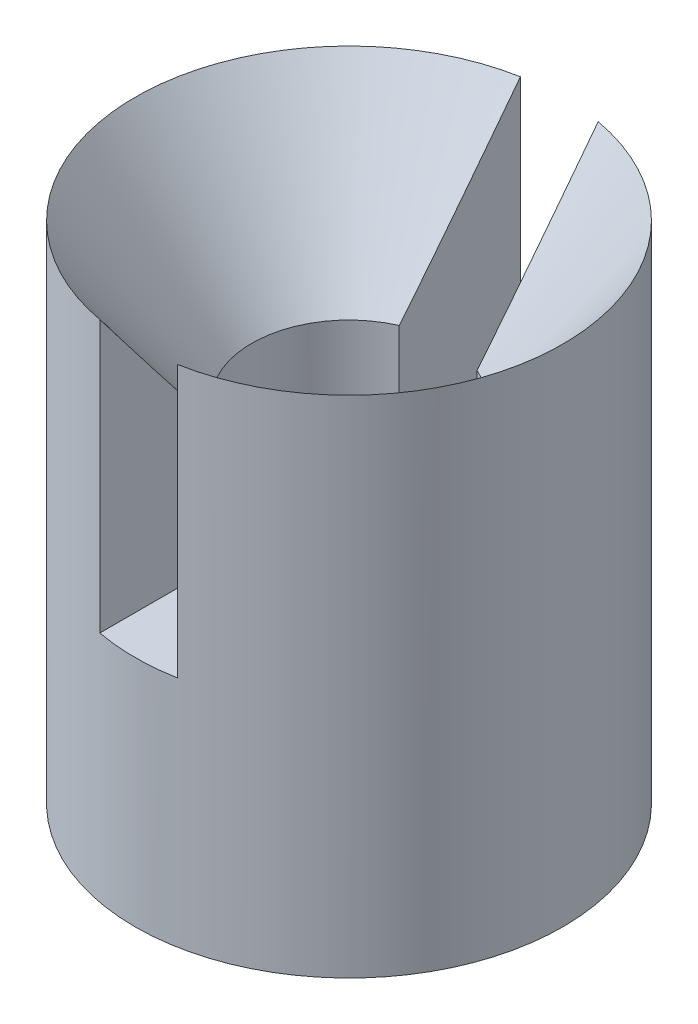
ISO-10303-21;
HEADER;
FILE_DESCRIPTION(('STEP AP214'),'2;1');
FILE_NAME('part.step','',(''),(''),'','','');
FILE_SCHEMA(('AUTOMOTIVE_DESIGN { 1 0 10303 214 1 1 1 1 }'));
ENDSEC;
DATA;
#1=APPLICATION_CONTEXT('core data for automotive mechanical design processes');
#2=APPLICATION_PROTOCOL_DEFINITION('international standard','automotive_design',2000,#1);
#3=PRODUCT_CONTEXT('',#1,'mechanical');
#4=PRODUCT('Part','Part','',(#3));
#5=PRODUCT_RELATED_PRODUCT_CATEGORY('part','',(#4));
#6=PRODUCT_DEFINITION_FORMATION('','',#4);
#7=PRODUCT_DEFINITION_CONTEXT('part definition',#1,'design');
#8=PRODUCT_DEFINITION('design','',#6,#7);
#9=PRODUCT_DEFINITION_SHAPE('','',#8);
#10=(LENGTH_UNIT() NAMED_UNIT(*) SI_UNIT(.MILLI.,.METRE.));
#11=(NAMED_UNIT(*) PLANE_ANGLE_UNIT() SI_UNIT($,.RADIAN.));
#12=(NAMED_UNIT(*) SI_UNIT($,.STERADIAN.) SOLID_ANGLE_UNIT());
#13=UNCERTAINTY_MEASURE_WITH_UNIT(LENGTH_MEASURE(1.E-05),#10,'distance_accuracy_value','');
#14=(GEOMETRIC_REPRESENTATION_CONTEXT(3) GLOBAL_UNCERTAINTY_ASSIGNED_CONTEXT((#13)) GLOBAL_UNIT_ASSIGNED_CONTEXT((#10,
#11,#12)) REPRESENTATION_CONTEXT('',''));
#15=CARTESIAN_POINT('',(0.,0.,0.));
#16=DIRECTION('',(0.,0.,1.));
#17=DIRECTION('',(1.,0.,0.));
#18=AXIS2_PLACEMENT_3D('',#15,#16,#17);
#19=CARTESIAN_POINT('',(0.,13.,0.));
#20=DIRECTION('',(0.,1.,0.));
#21=DIRECTION('',(0.,0.,1.));
#22=AXIS2_PLACEMENT_3D('',#19,#20,#21);
#23=CONICAL_SURFACE('',#22,5.51421620041123,0.645771823237908);
#24=CARTESIAN_POINT('',(1.,20.0002941730964,10.7428741328628));
#25=CARTESIAN_POINT('',(1.,19.5572568844563,10.4075700440478));
#26=CARTESIAN_POINT('',(1.,19.1142769277897,10.0721901071016));
#27=CARTESIAN_POINT('',(1.,18.2284880326646,9.40119389962484));
#28=CARTESIAN_POINT('',(1.,17.785679096232,9.06557762641997));
#29=CARTESIAN_POINT('',(1.,16.9000714503903,8.39385938529458));
#30=CARTESIAN_POINT('',(1.,16.4572728630148,8.05775725645944));
#31=CARTESIAN_POINT('',(1.,15.5720236336449,7.38510481824053));
#32=CARTESIAN_POINT('',(1.,15.1295729879461,7.048554513734));
#33=CARTESIAN_POINT('',(1.,14.2363646525991,6.36804384646309));
#34=CARTESIAN_POINT('',(1.,13.785617471277,6.02406968937443));
#35=CARTESIAN_POINT('',(1.,12.8849813381015,5.33496775314951));
#36=CARTESIAN_POINT('',(1.,12.4350924143107,4.98983993727405));
#37=CARTESIAN_POINT('',(1.,11.7615486682919,4.47064147870609));
#38=CARTESIAN_POINT('',(1.,11.5372892363928,4.29735549881531));
#39=CARTESIAN_POINT('',(1.,11.0893529847068,3.95003251258751));
#40=CARTESIAN_POINT('',(1.,10.8656761633301,3.77599550830345));
#41=CARTESIAN_POINT('',(1.,10.4192004138533,3.42682263741065));
#42=CARTESIAN_POINT('',(1.,10.1964014401587,3.25168682913083));
#43=CARTESIAN_POINT('',(1.,9.75216467514172,2.89969921612953));
#44=CARTESIAN_POINT('',(1.,9.53072685489181,2.72284744808345));
#45=CARTESIAN_POINT('',(1.,9.23880079875277,2.48647671798363));
#46=CARTESIAN_POINT('',(1.,9.16724403039782,2.4282786279387));
#47=CARTESIAN_POINT('',(1.,9.02445172826056,2.31148907272611));
#48=CARTESIAN_POINT('',(1.,8.95321619738928,2.25289760400562));
#49=CARTESIAN_POINT('',(1.,8.74003509622941,2.07636889774789));
#50=CARTESIAN_POINT('',(1.,8.59867126634714,1.95772269575603));
#51=CARTESIAN_POINT('',(1.,8.38863552322725,1.77751739602667));
#52=CARTESIAN_POINT('',(1.,8.31898494037146,1.71709989940378));
#53=CARTESIAN_POINT('',(1.,8.18056880915568,1.59526106585857));
#54=CARTESIAN_POINT('',(1.,8.11180322813382,1.5338397661736));
#55=CARTESIAN_POINT('',(1.,7.97553216178827,1.40969093636041));
#56=CARTESIAN_POINT('',(1.,7.90802595793587,1.34696419713075));
#57=CARTESIAN_POINT('',(1.,7.77477384221221,1.21967437620374));
#58=CARTESIAN_POINT('',(1.,7.70902760580835,1.15511163765075));
#59=CARTESIAN_POINT('',(1.,7.60552708760029,1.04922592237541));
#60=CARTESIAN_POINT('',(1.,7.56692231193917,1.00873661214665));
#61=CARTESIAN_POINT('',(1.,7.49103682193907,0.926505600124174));
#62=CARTESIAN_POINT('',(1.,7.45375650589476,0.884763528443368));
#63=CARTESIAN_POINT('',(1.,7.38108875704079,0.799760934186454));
#64=CARTESIAN_POINT('',(1.,7.34569850572645,0.756502841498857));
#65=CARTESIAN_POINT('',(1.,7.27754636127396,0.667979077667228));
#66=CARTESIAN_POINT('',(1.,7.24478287081523,0.622714652973922));
#67=CARTESIAN_POINT('',(1.,7.18235393425491,0.528489189534335));
#68=CARTESIAN_POINT('',(1.,7.15278077774387,0.479465811754451));
#69=CARTESIAN_POINT('',(1.,7.09979931783745,0.378137404196767));
#70=CARTESIAN_POINT('',(1.,7.07638322907602,0.325836623256992));
#71=CARTESIAN_POINT('',(1.,7.04257261665416,0.228685703395252));
#72=CARTESIAN_POINT('',(1.,7.03051130885871,0.184434212829363));
#73=CARTESIAN_POINT('',(1.,7.01405211412496,0.094553320190419));
#74=CARTESIAN_POINT('',(1.,7.00963828573768,0.0489269866460284));
#75=CARTESIAN_POINT('',(1.,7.00924091230474,-0.0425082539340172));
#76=CARTESIAN_POINT('',(1.,7.0132836142135,-0.0883172876372139));
#77=CARTESIAN_POINT('',(1.,7.02910971849693,-0.178576410001475));
#78=CARTESIAN_POINT('',(1.,7.04090555045966,-0.223024196397545));
#79=CARTESIAN_POINT('',(1.,7.07873465286279,-0.333821498103945));
#80=CARTESIAN_POINT('',(1.,7.10903438767963,-0.398680198994051));
#81=CARTESIAN_POINT('',(1.,7.1610078518799,-0.492230722979095));
#82=CARTESIAN_POINT('',(1.,7.1794781330186,-0.52286854802281));
#83=CARTESIAN_POINT('',(1.,7.21812533886481,-0.58304777284815));
#84=CARTESIAN_POINT('',(1.,7.23830162383313,-0.612589577702807));
#85=CARTESIAN_POINT('',(1.,7.29928684941007,-0.697701678105858));
#86=CARTESIAN_POINT('',(1.,7.34186967502095,-0.751989379124324));
#87=CARTESIAN_POINT('',(1.,7.430114281867,-0.858021646327089));
#88=CARTESIAN_POINT('',(1.,7.47577854206406,-0.909764105635548));
#89=CARTESIAN_POINT('',(1.,7.56927885321635,-1.0114706924909));
#90=CARTESIAN_POINT('',(1.,7.61711997358604,-1.06143012892685));
#91=CARTESIAN_POINT('',(1.,7.71425371759788,-1.15991968961526));
#92=CARTESIAN_POINT('',(1.,7.76354652124488,-1.20844963510966));
#93=CARTESIAN_POINT('',(1.,7.86344233680111,-1.30465792969611));
#94=CARTESIAN_POINT('',(1.,7.91405078369606,-1.35233061471387));
#95=CARTESIAN_POINT('',(1.,8.0160703103585,-1.4468143442931));
#96=CARTESIAN_POINT('',(1.,8.06748144960891,-1.4936253244331));
#97=CARTESIAN_POINT('',(1.,8.17083047167161,-1.58648125923365));
#98=CARTESIAN_POINT('',(1.,8.22276729998338,-1.63252738988049));
#99=CARTESIAN_POINT('',(1.,8.32712344202414,-1.7240652687308));
#100=CARTESIAN_POINT('',(1.,8.37954274023283,-1.76955703465868));
#101=CARTESIAN_POINT('',(1.,8.53588499883651,-1.90407565426737));
#102=CARTESIAN_POINT('',(1.,8.64036399909784,-1.9924559993795));
#103=CARTESIAN_POINT('',(1.,8.85033589181411,-2.16800544737816));
#104=CARTESIAN_POINT('',(1.,8.95582881592434,-2.25517451223866));
#105=CARTESIAN_POINT('',(1.,9.27339246226653,-2.51539817515117));
#106=CARTESIAN_POINT('',(1.,9.48652779532298,-2.6871520750145));
#107=CARTESIAN_POINT('',(1.,9.91455229194019,-3.02884191076541));
#108=CARTESIAN_POINT('',(1.,10.1294428470527,-3.19877609344218));
#109=CARTESIAN_POINT('',(1.,10.5601984956423,-3.53737855832125));
#110=CARTESIAN_POINT('',(1.,10.7760635323212,-3.70604691281579));
#111=CARTESIAN_POINT('',(1.,11.2072386579882,-4.04160684830299));
#112=CARTESIAN_POINT('',(1.,11.4225451235814,-4.20850309203793));
#113=CARTESIAN_POINT('',(1.,11.8536140956032,-4.54171192682426));
#114=CARTESIAN_POINT('',(1.,12.0693766087207,-4.70802450921869));
#115=CARTESIAN_POINT('',(1.,12.7170022223273,-5.20621771913083));
#116=CARTESIAN_POINT('',(1.,13.1493502522167,-5.53746769292153));
#117=CARTESIAN_POINT('',(1.,14.1140952246104,-6.27492789079229));
#118=CARTESIAN_POINT('',(1.,14.6466794315791,-6.6808928422669));
#119=CARTESIAN_POINT('',(1.,15.7125487384779,-7.49203509914152));
#120=CARTESIAN_POINT('',(1.,16.2458339153868,-7.89721230334165));
#121=CARTESIAN_POINT('',(1.,17.3158610412494,-8.70936532565081));
#122=CARTESIAN_POINT('',(1.,17.8526052749655,-9.11633813248853));
#123=CARTESIAN_POINT('',(1.,18.9263053198709,-9.92986608993493));
#124=CARTESIAN_POINT('',(1.,19.4632610965262,-10.3364212861172));
#125=CARTESIAN_POINT('',(1.,20.0002941730964,-10.7428741328628));
#126=B_SPLINE_CURVE_WITH_KNOTS('',3,(#24,#25,#26,#27,#28,#29,#30,#31,#32,#33,#34,#35,#36,#37,
#38,#39,#40,#41,#42,#43,#44,#45,#46,#47,#48,#49,#50,#51,#52,#53,#54,#55,#56,#57,#58,#59,#60,#61,
#62,#63,#64,#65,#66,#67,#68,#69,#70,#71,#72,#73,#74,#75,#76,#77,#78,#79,#80,#81,#82,#83,#84,#85,
#86,#87,#88,#89,#90,#91,#92,#93,#94,#95,#96,#97,#98,#99,#100,#101,#102,#103,#104,#105,#106,#107,
#108,#109,#110,#111,#112,#113,#114,#115,#116,#117,#118,#119,#120,#121,#122,#123,#124,#125),
.UNSPECIFIED.,.F.,.F.,(4,2,2,2,2,2,2,2,2,2,2,2,2,2,2,2,2,2,2,2,2,2,2,2,2,2,2,2,2,2,2,2,2,2,2,2,
2,2,2,2,2,2,2,2,2,2,2,2,2,2,4),(0.,1.66685275626156,3.33372468776584,5.00145263391156,
6.66916257702269,8.37016783049214,10.0712277799843,10.9214520372964,11.7716739719603,
12.6218511490028,13.4720101949754,13.7487152725925,14.0254228526648,14.579054737977,
14.8556585659354,15.1322521561085,15.4086827884183,15.685062091654,15.8528721505106,
16.0207322536554,16.1883346188902,16.3558342804697,16.5273203470832,16.6985885221683,
16.8356444821365,16.9724143986919,17.1096094446236,17.2470249758211,17.4604813642317,
17.5677877221812,17.6750540179742,17.881848924883,18.0888122251841,18.2962849901485,
18.5037835904091,18.7123494596782,18.9209308586207,19.1291545631297,19.3373715926532,
19.747895417766,20.1584321015703,20.9795851292336,21.8014686647007,22.6233048991343,
23.440555844574,24.2578188608089,25.8917873830081,27.9007862532807,29.9100281012241,
31.9307929177938,33.9513068928873),.UNSPECIFIED.);
#127=CARTESIAN_POINT('',(1.,12.9811344648612,5.40832691319598));
#128=VERTEX_POINT('',#127);
#129=CARTESIAN_POINT('',(1.,8.99999999999998,2.29128784747792));
#130=VERTEX_POINT('',#129);
#131=EDGE_CURVE('E226',#128,#130,#126,.T.);
#132=ORIENTED_EDGE('',*,*,#131,.F.);
#133=CARTESIAN_POINT('',(0.,12.9811344648612,0.));
#134=DIRECTION('',(0.,1.,0.));
#135=DIRECTION('',(0.,0.,1.));
#136=AXIS2_PLACEMENT_3D('',#133,#134,#135);
#137=CIRCLE('',#136,5.5);
#138=CARTESIAN_POINT('',(1.,12.9811344648612,-5.40832691319598));
#139=VERTEX_POINT('',#138);
#140=EDGE_CURVE('E157',#139,#128,#137,.F.);
#141=ORIENTED_EDGE('',*,*,#140,.F.);
#142=CARTESIAN_POINT('',(1.,9.00000000000002,-2.29128784747796));
#143=VERTEX_POINT('',#142);
#144=EDGE_CURVE('E171',#143,#139,#126,.T.);
#145=ORIENTED_EDGE('',*,*,#144,.F.);
#146=CARTESIAN_POINT('',(0.,8.99999999999998,0.));
#147=DIRECTION('',(0.,1.,0.));
#148=DIRECTION('',(0.,0.,1.));
#149=AXIS2_PLACEMENT_3D('',#146,#147,#148);
#150=CIRCLE('',#149,2.5);
#151=EDGE_CURVE('E160',#130,#143,#150,.T.);
#152=ORIENTED_EDGE('',*,*,#151,.F.);
#153=EDGE_LOOP('',(#132,#141,#145,#152));
#154=FACE_BOUND('',#153,.T.);
#155=ADVANCED_FACE('F38',(#154),#23,.F.);
#156=CARTESIAN_POINT('',(0.,13.,0.));
#157=DIRECTION('',(0.,-1.,0.));
#158=DIRECTION('',(0.,0.,-1.));
#159=AXIS2_PLACEMENT_3D('',#156,#157,#158);
#160=CYLINDRICAL_SURFACE('',#159,5.5);
#161=CARTESIAN_POINT('',(-5.40832691319598,3.,-1.));
#162=CARTESIAN_POINT('',(-5.40832797364528,3.05567006127892,-0.999997833744766));
#163=CARTESIAN_POINT('',(-5.40919579392021,3.11136859562177,-0.995335502119674));
#164=CARTESIAN_POINT('',(-5.41256931618596,3.22119730791599,-0.976820659835411));
#165=CARTESIAN_POINT('',(-5.41507644189578,3.27532607983057,-0.962960160510875));
#166=CARTESIAN_POINT('',(-5.4214354513315,3.38041015651649,-0.926486846446966));
#167=CARTESIAN_POINT('',(-5.42528611875607,3.43136828265596,-0.903881945963433));
#168=CARTESIAN_POINT('',(-5.43389689920319,3.52876494581254,-0.850582127042014));
#169=CARTESIAN_POINT('',(-5.438656932397,3.57520387900767,-0.819887918635019));
#170=CARTESIAN_POINT('',(-5.4486123689521,3.66279172372141,-0.750897624119711));
#171=CARTESIAN_POINT('',(-5.45381181531897,3.70388003711712,-0.71252517673902));
#172=CARTESIAN_POINT('',(-5.46402446588599,3.77907278141707,-0.629432698170839));
#173=CARTESIAN_POINT('',(-5.46903765818916,3.81317676682265,-0.584712262381758));
#174=CARTESIAN_POINT('',(-5.47835611996116,3.87366365922516,-0.489796709499925));
#175=CARTESIAN_POINT('',(-5.48265607320122,3.89998963499791,-0.439564745239941));
#176=CARTESIAN_POINT('',(-5.49001838668285,3.94380666651306,-0.335299887218807));
#177=CARTESIAN_POINT('',(-5.49308084259509,3.96129840525468,-0.28126728766334));
#178=CARTESIAN_POINT('',(-5.49759455294158,3.98676361662773,-0.171562418910428));
#179=CARTESIAN_POINT('',(-5.49906307272621,3.99483915716036,-0.115914564259384));
#180=CARTESIAN_POINT('',(-5.50028290444734,4.0015605837312,-0.00403573648296223));
#181=CARTESIAN_POINT('',(-5.50003435424197,4.00020722678577,0.0521951894675193));
#182=CARTESIAN_POINT('',(-5.49786159276056,3.98818792896104,0.16294459807037));
#183=CARTESIAN_POINT('',(-5.49595715438454,3.97763187324278,0.217475450026675));
#184=CARTESIAN_POINT('',(-5.49070873453988,3.94768040126925,0.323978745301683));
#185=CARTESIAN_POINT('',(-5.48736470295951,3.92828467730688,0.375951099489802));
#186=CARTESIAN_POINT('',(-5.47957960186178,3.88109847011042,0.476183112726923));
#187=CARTESIAN_POINT('',(-5.47513276511691,3.85326367798308,0.524421446258733));
#188=CARTESIAN_POINT('',(-5.46563448410861,3.79002205503766,0.615583816786463));
#189=CARTESIAN_POINT('',(-5.4605829819214,3.75461449853225,0.65850734384911));
#190=CARTESIAN_POINT('',(-5.4503495404642,3.67662577271036,0.738472225271972));
#191=CARTESIAN_POINT('',(-5.44516677076057,3.63394849104051,0.775419797024746));
#192=CARTESIAN_POINT('',(-5.4353248103429,3.54295296803954,0.84164635982083));
#193=CARTESIAN_POINT('',(-5.43066562641452,3.49463465361737,0.870925251484836));
#194=CARTESIAN_POINT('',(-5.42239736704917,3.39360874475659,0.921007691245463));
#195=CARTESIAN_POINT('',(-5.41878990006368,3.34089458418011,0.941798276926112));
#196=CARTESIAN_POINT('',(-5.41305866738468,3.23264127505582,0.97420188443499));
#197=CARTESIAN_POINT('',(-5.41093474435718,3.17710242674443,0.985815879483378));
#198=CARTESIAN_POINT('',(-5.40844202046372,3.0656200993973,0.99940108925773));
#199=CARTESIAN_POINT('',(-5.40804875191389,3.00969353366518,1.00150674244582));
#200=CARTESIAN_POINT('',(-5.40899647576945,2.89828772471946,0.996375273894248));
#201=CARTESIAN_POINT('',(-5.41033738779432,2.84280846089302,0.989138585178943));
#202=CARTESIAN_POINT('',(-5.41457964689337,2.73430982797386,0.965643048194486));
#203=CARTESIAN_POINT('',(-5.41746890003943,2.68127480799599,0.94945409427688));
#204=CARTESIAN_POINT('',(-5.42447195400378,2.57867014058578,0.908587487859388));
#205=CARTESIAN_POINT('',(-5.42858584033864,2.52910073545716,0.88390924253054));
#206=CARTESIAN_POINT('',(-5.43763067076332,2.43424040199238,0.826452930939969));
#207=CARTESIAN_POINT('',(-5.44257002421489,2.38900194095781,0.793589589707833));
#208=CARTESIAN_POINT('',(-5.45268533146011,2.30463315420112,0.720811524753681));
#209=CARTESIAN_POINT('',(-5.45786130517501,2.26550334400017,0.680896206506622));
#210=CARTESIAN_POINT('',(-5.46794493022657,2.19396357692511,0.594548150036306));
#211=CARTESIAN_POINT('',(-5.47284841413378,2.1616438223191,0.548040116261882));
#212=CARTESIAN_POINT('',(-5.48176540688883,2.1052768469585,0.450176309896763));
#213=CARTESIAN_POINT('',(-5.48577894853028,2.08122932136141,0.398820716033924));
#214=CARTESIAN_POINT('',(-5.49244586315787,2.04222598068178,0.292974109172671));
#215=CARTESIAN_POINT('',(-5.49510597552399,2.02722504756174,0.238500164676975));
#216=CARTESIAN_POINT('',(-5.49879498739045,2.00659632835142,0.12775332448174));
#217=CARTESIAN_POINT('',(-5.49982404783879,2.00096761743164,0.071480606839617));
#218=CARTESIAN_POINT('',(-5.50013207106945,1.99927373944725,-0.0403998095144106));
#219=CARTESIAN_POINT('',(-5.49943601615581,2.00307205575767,-0.096005418962731));
#220=CARTESIAN_POINT('',(-5.49642366951049,2.01982647321196,-0.205772269495427));
#221=CARTESIAN_POINT('',(-5.4941073913589,2.03278249759946,-0.259933522681888));
#222=CARTESIAN_POINT('',(-5.48811453453941,2.06742845174468,-0.365207716720242));
#223=CARTESIAN_POINT('',(-5.48444009174284,2.08910467268796,-0.416325298323197));
#224=CARTESIAN_POINT('',(-5.47612961195727,2.1405597014042,-0.514218505970988));
#225=CARTESIAN_POINT('',(-5.47149351575705,2.17033900813803,-0.560993864398311));
#226=CARTESIAN_POINT('',(-5.46169295104726,2.23762881928164,-0.64955729876811));
#227=CARTESIAN_POINT('',(-5.45652218977741,2.27523834769477,-0.69126944929362));
#228=CARTESIAN_POINT('',(-5.44627585142043,2.35691475834417,-0.767838111774054));
#229=CARTESIAN_POINT('',(-5.44120029696122,2.40098315427109,-0.802693012176555));
#230=CARTESIAN_POINT('',(-5.43167141434991,2.49477983780895,-0.864838359022299));
#231=CARTESIAN_POINT('',(-5.42722382409738,2.54455361968942,-0.892061042527094));
#232=CARTESIAN_POINT('',(-5.41952308783751,2.64803163839711,-0.937715294552637));
#233=CARTESIAN_POINT('',(-5.41626879622786,2.70173204581306,-0.956155299818061));
#234=CARTESIAN_POINT('',(-5.41201405367096,2.79633834221095,-0.979899481024946));
#235=CARTESIAN_POINT('',(-5.4106394360599,2.83668463130228,-0.987424495948277));
#236=CARTESIAN_POINT('',(-5.40879548637076,2.91801547601812,-0.997475492125671));
#237=CARTESIAN_POINT('',(-5.40832613219443,2.95900001603777,-1.00000159540744));
#238=CARTESIAN_POINT('',(-5.40832691319598,3.,-1.));
#239=B_SPLINE_CURVE_WITH_KNOTS('',3,(#161,#162,#163,#164,#165,#166,#167,#168,#169,#170,#171,
#172,#173,#174,#175,#176,#177,#178,#179,#180,#181,#182,#183,#184,#185,#186,#187,#188,#189,#190,
#191,#192,#193,#194,#195,#196,#197,#198,#199,#200,#201,#202,#203,#204,#205,#206,#207,#208,#209,
#210,#211,#212,#213,#214,#215,#216,#217,#218,#219,#220,#221,#222,#223,#224,#225,#226,#227,#228,
#229,#230,#231,#232,#233,#234,#235,#236,#237,#238),.UNSPECIFIED.,.T.,.F.,(4,2,2,2,2,2,2,2,2,2,2,
2,2,2,2,2,2,2,2,2,2,2,2,2,2,2,2,2,2,2,2,2,2,2,2,2,2,2,4),(0.,0.166860176303694,
0.333865461691934,0.500719948670008,0.66755979503768,0.836149675555552,1.00475030631164,
1.17455606253914,1.34434868860495,1.51228319705907,1.6802042227379,1.84614722644409,
2.01209600703444,2.17893164241915,2.34578327259646,2.51504175421998,2.68430242917503,
2.85382062241291,3.0233208350432,3.19041682321415,3.35750506664222,3.52330682829013,
3.68912017065095,3.85673910114988,4.02437216970491,4.19410261282722,4.36382680048964,
4.53269736835609,4.70155127147238,4.86797423941391,5.03439581247915,5.20055677418129,
5.36672796983505,5.53514439851506,5.70360036032117,5.87350774145283,6.04325157670206,
6.16614405072609,6.28903352480283),.UNSPECIFIED.);
#240=CARTESIAN_POINT('',(-5.40832691319598,3.,-1.));
#241=VERTEX_POINT('',#240);
#242=EDGE_CURVE('E200',#241,#241,#239,.T.);
#243=ORIENTED_EDGE('',*,*,#242,.T.);
#244=EDGE_LOOP('',(#243));
#245=FACE_BOUND('',#244,.T.);
#246=ORIENTED_EDGE('',*,*,#140,.T.);
#247=DIRECTION('',(0.,-1.,0.));
#248=VECTOR('',#247,1.);
#249=CARTESIAN_POINT('',(1.,13.,5.40832691319598));
#250=LINE('',#249,#248);
#251=CARTESIAN_POINT('',(1.,6.,5.40832691319598));
#252=VERTEX_POINT('',#251);
#253=EDGE_CURVE('E122',#128,#252,#250,.T.);
#254=ORIENTED_EDGE('',*,*,#253,.T.);
#255=CARTESIAN_POINT('',(0.,6.,0.));
#256=DIRECTION('',(0.,-1.,0.));
#257=DIRECTION('',(0.,0.,-1.));
#258=AXIS2_PLACEMENT_3D('',#255,#256,#257);
#259=CIRCLE('',#258,5.5);
#260=CARTESIAN_POINT('',(-1.,6.,5.40832691319598));
#261=VERTEX_POINT('',#260);
#262=EDGE_CURVE('E121',#252,#261,#259,.T.);
#263=ORIENTED_EDGE('',*,*,#262,.T.);
#264=DIRECTION('',(0.,-1.,0.));
#265=VECTOR('',#264,1.);
#266=CARTESIAN_POINT('',(-1.,13.,5.40832691319598));
#267=LINE('',#266,#265);
#268=CARTESIAN_POINT('',(-1.,12.9811344648612,5.40832691319598));
#269=VERTEX_POINT('',#268);
#270=EDGE_CURVE('E141',#261,#269,#267,.F.);
#271=ORIENTED_EDGE('',*,*,#270,.T.);
#272=CARTESIAN_POINT('',(-1.,12.9811344648612,-5.40832691319598));
#273=VERTEX_POINT('',#272);
#274=EDGE_CURVE('E135',#269,#273,#137,.F.);
#275=ORIENTED_EDGE('',*,*,#274,.T.);
#276=DIRECTION('',(0.,-1.,0.));
#277=VECTOR('',#276,1.);
#278=CARTESIAN_POINT('',(-1.,13.,-5.40832691319598));
#279=LINE('',#278,#277);
#280=CARTESIAN_POINT('',(-1.,6.,-5.40832691319598));
#281=VERTEX_POINT('',#280);
#282=EDGE_CURVE('E60',#273,#281,#279,.T.);
#283=ORIENTED_EDGE('',*,*,#282,.T.);
#284=CARTESIAN_POINT('',(1.,6.,-5.40832691319598));
#285=VERTEX_POINT('',#284);
#286=EDGE_CURVE('E113',#281,#285,#259,.T.);
#287=ORIENTED_EDGE('',*,*,#286,.T.);
#288=DIRECTION('',(0.,-1.,0.));
#289=VECTOR('',#288,1.);
#290=CARTESIAN_POINT('',(1.,13.,-5.40832691319598));
#291=LINE('',#290,#289);
#292=EDGE_CURVE('E139',#285,#139,#291,.F.);
#293=ORIENTED_EDGE('',*,*,#292,.T.);
#294=EDGE_LOOP('',(#246,#254,#263,#271,#275,#283,#287,#293));
#295=FACE_BOUND('',#294,.T.);
#296=CARTESIAN_POINT('',(0.,0.,0.));
#297=DIRECTION('',(0.,1.,0.));
#298=DIRECTION('',(0.,0.,1.));
#299=AXIS2_PLACEMENT_3D('',#296,#297,#298);
#300=CIRCLE('',#299,5.5);
#301=CARTESIAN_POINT('',(0.,0.,5.5));
#302=VERTEX_POINT('',#301);
#303=EDGE_CURVE('E154',#302,#302,#300,.T.);
#304=ORIENTED_EDGE('',*,*,#303,.T.);
#305=EDGE_LOOP('',(#304));
#306=FACE_BOUND('',#305,.T.);
#307=ADVANCED_FACE('F131',(#245,#295,#306),#160,.T.);
#308=CARTESIAN_POINT('',(0.,0.,0.));
#309=DIRECTION('',(0.,1.,0.));
#310=DIRECTION('',(0.,0.,1.));
#311=AXIS2_PLACEMENT_3D('',#308,#309,#310);
#312=PLANE('',#311);
#313=CARTESIAN_POINT('',(0.,0.,0.));
#314=DIRECTION('',(0.,-1.,0.));
#315=DIRECTION('',(0.,0.,-1.));
#316=AXIS2_PLACEMENT_3D('',#313,#314,#315);
#317=CIRCLE('',#316,2.5);
#318=CARTESIAN_POINT('',(0.,0.,-2.5));
#319=VERTEX_POINT('',#318);
#320=EDGE_CURVE('E151',#319,#319,#317,.T.);
#321=ORIENTED_EDGE('',*,*,#320,.F.);
#322=EDGE_LOOP('',(#321));
#323=FACE_BOUND('',#322,.T.);
#324=ORIENTED_EDGE('',*,*,#303,.F.);
#325=EDGE_LOOP('',(#324));
#326=FACE_BOUND('',#325,.T.);
#327=ADVANCED_FACE('F192',(#323,#326),#312,.F.);
#328=CARTESIAN_POINT('',(0.,13.,0.));
#329=DIRECTION('',(0.,-1.,0.));
#330=DIRECTION('',(0.,0.,-1.));
#331=AXIS2_PLACEMENT_3D('',#328,#329,#330);
#332=CYLINDRICAL_SURFACE('',#331,2.5);
#333=CARTESIAN_POINT('',(-2.29128784747792,3.,-1.));
#334=CARTESIAN_POINT('',(-2.29129325828211,2.94643025095005,-0.999994127101894));
#335=CARTESIAN_POINT('',(-2.29319301242133,2.89278473264765,-0.995669909297176));
#336=CARTESIAN_POINT('',(-2.30055457093922,2.78703258356147,-0.978534515296365));
#337=CARTESIAN_POINT('',(-2.30602547693426,2.73493024145976,-0.965701652221065));
#338=CARTESIAN_POINT('',(-2.31980227895648,2.63397352901497,-0.932117516284352));
#339=CARTESIAN_POINT('',(-2.32809748178557,2.58510772631987,-0.911396076262712));
#340=CARTESIAN_POINT('',(-2.3465733254764,2.49155747457019,-0.862710134685805));
#341=CARTESIAN_POINT('',(-2.35675355451961,2.44687211542457,-0.83474721463375));
#342=CARTESIAN_POINT('',(-2.37850432525516,2.36036979887927,-0.77066098729371));
#343=CARTESIAN_POINT('',(-2.39011958979373,2.31882178853527,-0.734189678863664));
#344=CARTESIAN_POINT('',(-2.41306228489405,2.24223550134231,-0.654854552887023));
#345=CARTESIAN_POINT('',(-2.42438961368186,2.20719949935507,-0.611988510837841));
#346=CARTESIAN_POINT('',(-2.44601703953427,2.14329680150865,-0.51900315517819));
#347=CARTESIAN_POINT('',(-2.45625901841784,2.11472784926468,-0.468664482806142));
#348=CARTESIAN_POINT('',(-2.47401963815773,2.0665782158051,-0.363412661437561));
#349=CARTESIAN_POINT('',(-2.48153938692337,2.04699387710903,-0.308501384643982));
#350=CARTESIAN_POINT('',(-2.49269162504142,2.0183292567813,-0.198483213419447));
#351=CARTESIAN_POINT('',(-2.49649468387678,2.00878634295549,-0.143514492402304));
#352=CARTESIAN_POINT('',(-2.50040155341352,1.99898575716865,-0.0326331643188267));
#353=CARTESIAN_POINT('',(-2.50050674384656,1.99872462203258,0.0232790829127004));
#354=CARTESIAN_POINT('',(-2.49710981410893,2.00724138488749,0.131116247357655));
#355=CARTESIAN_POINT('',(-2.49380998385918,2.01551238637347,0.183088726437016));
#356=CARTESIAN_POINT('',(-2.48424645734395,2.03999643815538,0.284836554609168));
#357=CARTESIAN_POINT('',(-2.47798254360556,2.05621007120019,0.334611742195078));
#358=CARTESIAN_POINT('',(-2.4629841222885,2.09631824143815,0.431448969255827));
#359=CARTESIAN_POINT('',(-2.454213802334,2.12032485740777,0.478458811689816));
#360=CARTESIAN_POINT('',(-2.43507292589849,2.1752325034595,0.567904075370287));
#361=CARTESIAN_POINT('',(-2.42470182132537,2.20613589654881,0.610337921358054));
#362=CARTESIAN_POINT('',(-2.40260818589167,2.2763245679733,0.692384413996075));
#363=CARTESIAN_POINT('',(-2.3908416326012,2.31602694629192,0.731628922636821));
#364=CARTESIAN_POINT('',(-2.36780830482389,2.40149528591048,0.803053707692663));
#365=CARTESIAN_POINT('',(-2.35654169488174,2.44726322407708,0.835231671879828));
#366=CARTESIAN_POINT('',(-2.33548448720906,2.54520951120448,0.892452094371465));
#367=CARTESIAN_POINT('',(-2.32574457090691,2.59753241524191,0.917267325867452));
#368=CARTESIAN_POINT('',(-2.30943795233662,2.70610774523101,0.957588129983133));
#369=CARTESIAN_POINT('',(-2.3028691896167,2.76235759238542,0.973099749202199));
#370=CARTESIAN_POINT('',(-2.29414879836282,2.87351788871802,0.993477474415979));
#371=CARTESIAN_POINT('',(-2.29175183224038,2.92830022356008,0.998936048404205));
#372=CARTESIAN_POINT('',(-2.29094748938549,3.03803860388397,1.00078066322451));
#373=CARTESIAN_POINT('',(-2.29253890281232,3.09299459163892,0.997169455296441));
#374=CARTESIAN_POINT('',(-2.29928022178566,3.19822946747744,0.981516447394262));
#375=CARTESIAN_POINT('',(-2.30422228898885,3.24859646869975,0.969966531011728));
#376=CARTESIAN_POINT('',(-2.31685025513936,3.346644202393,0.939402093455639));
#377=CARTESIAN_POINT('',(-2.32453676244372,3.39432433655365,0.920385917151197));
#378=CARTESIAN_POINT('',(-2.34216890929975,3.48780117889774,0.874567819740727));
#379=CARTESIAN_POINT('',(-2.35219352319567,3.53344309434723,0.847481434132298));
#380=CARTESIAN_POINT('',(-2.37325192578919,3.61974149372083,0.786582612220938));
#381=CARTESIAN_POINT('',(-2.38428612448031,3.6603959363978,0.752767436740992));
#382=CARTESIAN_POINT('',(-2.40710457985699,3.73868670429961,0.676422105840242));
#383=CARTESIAN_POINT('',(-2.41888403642601,3.77587828264551,0.63343271472255));
#384=CARTESIAN_POINT('',(-2.44109897283781,3.84258853830517,0.541541816684422));
#385=CARTESIAN_POINT('',(-2.4515343979662,3.87210690329862,0.492640069233932));
#386=CARTESIAN_POINT('',(-2.46991857950143,3.92252381323061,0.390139967000881));
#387=CARTESIAN_POINT('',(-2.47786793120137,3.94342442208289,0.336542740497033));
#388=CARTESIAN_POINT('',(-2.49036356734645,3.97577442620381,0.226196795459613));
#389=CARTESIAN_POINT('',(-2.49491169853772,3.98722895072003,0.169449805147135));
#390=CARTESIAN_POINT('',(-2.49989504105256,3.99975235081269,0.0584082551731522));
#391=CARTESIAN_POINT('',(-2.50057923372437,4.00145006423133,0.00419524629652831));
#392=CARTESIAN_POINT('',(-2.49843021189296,3.99607226035795,-0.103716917866621));
#393=CARTESIAN_POINT('',(-2.49559752983456,3.98899807110719,-0.157416149697311));
#394=CARTESIAN_POINT('',(-2.48685756682127,3.96672660582076,-0.261085450973205));
#395=CARTESIAN_POINT('',(-2.48104740317165,3.95178552696222,-0.311119402324192));
#396=CARTESIAN_POINT('',(-2.46697473916019,3.91447359771909,-0.40796117737947));
#397=CARTESIAN_POINT('',(-2.45871178652006,3.89210137698983,-0.454768404133638));
#398=CARTESIAN_POINT('',(-2.44009047180029,3.83944840075533,-0.546101520928057));
#399=CARTESIAN_POINT('',(-2.42965564864115,3.80886185255746,-0.590435193403212));
#400=CARTESIAN_POINT('',(-2.40794701593224,3.74110574041053,-0.673527014262036));
#401=CARTESIAN_POINT('',(-2.3966728602525,3.70393345176994,-0.712282842872878));
#402=CARTESIAN_POINT('',(-2.37368881779711,3.62134238773748,-0.785600632542995));
#403=CARTESIAN_POINT('',(-2.36199516302692,3.57555556329945,-0.819754443599514));
#404=CARTESIAN_POINT('',(-2.3402483573759,3.47852893128562,-0.879923725219698));
#405=CARTESIAN_POINT('',(-2.33019539943728,3.42728848354507,-0.905938238949994));
#406=CARTESIAN_POINT('',(-2.31379432228954,3.32548139907597,-0.946995543836655));
#407=CARTESIAN_POINT('',(-2.30719459305824,3.27526738262441,-0.962813757082103));
#408=CARTESIAN_POINT('',(-2.29723001801982,3.17275729018483,-0.986358878909192));
#409=CARTESIAN_POINT('',(-2.29385616036088,3.12046744201652,-0.994108333944007));
#410=CARTESIAN_POINT('',(-2.29162229378817,3.04531121883104,-0.999232129155086));
#411=CARTESIAN_POINT('',(-2.29128555846679,3.0226623895012,-1.00000248449744));
#412=CARTESIAN_POINT('',(-2.29128784747792,3.,-1.));
#413=B_SPLINE_CURVE_WITH_KNOTS('',3,(#333,#334,#335,#336,#337,#338,#339,#340,#341,#342,#343,
#344,#345,#346,#347,#348,#349,#350,#351,#352,#353,#354,#355,#356,#357,#358,#359,#360,#361,#362,
#363,#364,#365,#366,#367,#368,#369,#370,#371,#372,#373,#374,#375,#376,#377,#378,#379,#380,#381,
#382,#383,#384,#385,#386,#387,#388,#389,#390,#391,#392,#393,#394,#395,#396,#397,#398,#399,#400,
#401,#402,#403,#404,#405,#406,#407,#408,#409,#410,#411,#412),.UNSPECIFIED.,.T.,.F.,(4,2,2,2,2,2,
2,2,2,2,2,2,2,2,2,2,2,2,2,2,2,2,2,2,2,2,2,2,2,2,2,2,2,2,2,2,2,2,2,4),(0.,0.160638824383827,
0.321688667911123,0.482135411646695,0.642547144119307,0.811278091422122,0.98006787174171,
1.15551334545714,1.3308873348474,1.49777091443592,1.66459222652836,1.82204322415151,
1.9795057756453,2.13934150117449,2.29923207470016,2.46962022040678,2.64006403563563,
2.81532229357288,2.99046652397056,3.15491073759215,3.31930507450975,3.47433624039577,
3.62940179322824,3.79075577323355,3.9521755725993,4.12551867120495,4.29886882423379,
4.47217743653411,4.64539187974073,4.80730519874981,4.96919400753306,5.12610997218681,
5.28305488911298,5.44693525566967,5.61088358279108,5.78498126639812,5.95909940876599,
6.11758330406543,6.27562315106627,6.34358052760367),.UNSPECIFIED.);
#414=CARTESIAN_POINT('',(-2.29128784747792,3.,-1.));
#415=VERTEX_POINT('',#414);
#416=EDGE_CURVE('E43',#415,#415,#413,.T.);
#417=ORIENTED_EDGE('',*,*,#416,.T.);
#418=EDGE_LOOP('',(#417));
#419=FACE_BOUND('',#418,.T.);
#420=CARTESIAN_POINT('',(0.,6.,0.));
#421=DIRECTION('',(0.,-1.,0.));
#422=DIRECTION('',(0.,0.,-1.));
#423=AXIS2_PLACEMENT_3D('',#420,#421,#422);
#424=CIRCLE('',#423,2.5);
#425=CARTESIAN_POINT('',(-1.,6.,2.29128784747792));
#426=VERTEX_POINT('',#425);
#427=CARTESIAN_POINT('',(1.,6.,2.29128784747792));
#428=VERTEX_POINT('',#427);
#429=EDGE_CURVE('E11',#426,#428,#424,.F.);
#430=ORIENTED_EDGE('',*,*,#429,.T.);
#431=DIRECTION('',(0.,-1.,0.));
#432=VECTOR('',#431,1.);
#433=CARTESIAN_POINT('',(1.,13.,2.29128784747792));
#434=LINE('',#433,#432);
#435=EDGE_CURVE('E146',#428,#130,#434,.F.);
#436=ORIENTED_EDGE('',*,*,#435,.T.);
#437=ORIENTED_EDGE('',*,*,#151,.T.);
#438=DIRECTION('',(0.,-1.,0.));
#439=VECTOR('',#438,1.);
#440=CARTESIAN_POINT('',(1.,13.,-2.29128784747792));
#441=LINE('',#440,#439);
#442=CARTESIAN_POINT('',(1.,6.,-2.29128784747792));
#443=VERTEX_POINT('',#442);
#444=EDGE_CURVE('E136',#143,#443,#441,.T.);
#445=ORIENTED_EDGE('',*,*,#444,.T.);
#446=CARTESIAN_POINT('',(-1.,6.,-2.29128784747792));
#447=VERTEX_POINT('',#446);
#448=EDGE_CURVE('E53',#443,#447,#424,.F.);
#449=ORIENTED_EDGE('',*,*,#448,.T.);
#450=DIRECTION('',(0.,-1.,0.));
#451=VECTOR('',#450,1.);
#452=CARTESIAN_POINT('',(-1.,13.,-2.29128784747792));
#453=LINE('',#452,#451);
#454=CARTESIAN_POINT('',(-1.,8.99999999999998,-2.29128784747792));
#455=VERTEX_POINT('',#454);
#456=EDGE_CURVE('E126',#447,#455,#453,.F.);
#457=ORIENTED_EDGE('',*,*,#456,.T.);
#458=CARTESIAN_POINT('',(-1.,8.99999999999998,2.29128784747792));
#459=VERTEX_POINT('',#458);
#460=EDGE_CURVE('E159',#455,#459,#150,.T.);
#461=ORIENTED_EDGE('',*,*,#460,.T.);
#462=DIRECTION('',(0.,-1.,0.));
#463=VECTOR('',#462,1.);
#464=CARTESIAN_POINT('',(-1.,13.,2.29128784747792));
#465=LINE('',#464,#463);
#466=EDGE_CURVE('E68',#459,#426,#465,.T.);
#467=ORIENTED_EDGE('',*,*,#466,.T.);
#468=EDGE_LOOP('',(#430,#436,#437,#445,#449,#457,#461,#467));
#469=FACE_BOUND('',#468,.T.);
#470=ORIENTED_EDGE('',*,*,#320,.T.);
#471=EDGE_LOOP('',(#470));
#472=FACE_BOUND('',#471,.T.);
#473=ADVANCED_FACE('F188',(#419,#469,#472),#332,.F.);
#474=CARTESIAN_POINT('',(-1.,20.0002941730964,-10.7428741328628));
#475=CARTESIAN_POINT('',(-1.,19.5572568844563,-10.4075700440478));
#476=CARTESIAN_POINT('',(-1.,19.1142769277897,-10.0721901071016));
#477=CARTESIAN_POINT('',(-1.,18.2284880326646,-9.40119389962484));
#478=CARTESIAN_POINT('',(-1.,17.785679096232,-9.06557762641998));
#479=CARTESIAN_POINT('',(-1.,16.9000714503903,-8.39385938529458));
#480=CARTESIAN_POINT('',(-1.,16.4572728630148,-8.05775725645944));
#481=CARTESIAN_POINT('',(-1.,15.5720236336449,-7.38510481824053));
#482=CARTESIAN_POINT('',(-1.,15.1295729879461,-7.04855451373401));
#483=CARTESIAN_POINT('',(-1.,14.2363646525991,-6.36804384646309));
#484=CARTESIAN_POINT('',(-1.,13.785617471277,-6.02406968937443));
#485=CARTESIAN_POINT('',(-1.,12.8849813381015,-5.33496775314951));
#486=CARTESIAN_POINT('',(-1.,12.4350924143107,-4.98983993727405));
#487=CARTESIAN_POINT('',(-1.,11.7615486682919,-4.47064147870609));
#488=CARTESIAN_POINT('',(-1.,11.5372892363928,-4.29735549881531));
#489=CARTESIAN_POINT('',(-1.,11.0893529847068,-3.95003251258751));
#490=CARTESIAN_POINT('',(-1.,10.8656761633301,-3.77599550830345));
#491=CARTESIAN_POINT('',(-1.,10.4192004138533,-3.42682263741065));
#492=CARTESIAN_POINT('',(-1.,10.1964014401587,-3.25168682913083));
#493=CARTESIAN_POINT('',(-1.,9.75216467514172,-2.89969921612953));
#494=CARTESIAN_POINT('',(-1.,9.53072685489181,-2.72284744808345));
#495=CARTESIAN_POINT('',(-1.,9.23880079875277,-2.48647671798363));
#496=CARTESIAN_POINT('',(-1.,9.16724403039781,-2.4282786279387));
#497=CARTESIAN_POINT('',(-1.,9.02445172826056,-2.31148907272611));
#498=CARTESIAN_POINT('',(-1.,8.95321619738928,-2.25289760400562));
#499=CARTESIAN_POINT('',(-1.,8.74003509622941,-2.07636889774789));
#500=CARTESIAN_POINT('',(-1.,8.59867126634715,-1.95772269575603));
#501=CARTESIAN_POINT('',(-1.,8.38863552322725,-1.77751739602667));
#502=CARTESIAN_POINT('',(-1.,8.31898494037146,-1.71709989940379));
#503=CARTESIAN_POINT('',(-1.,8.18056880915568,-1.59526106585857));
#504=CARTESIAN_POINT('',(-1.,8.11180322813382,-1.5338397661736));
#505=CARTESIAN_POINT('',(-1.,7.97553216178827,-1.40969093636041));
#506=CARTESIAN_POINT('',(-1.,7.90802595793587,-1.34696419713075));
#507=CARTESIAN_POINT('',(-1.,7.77477384221221,-1.21967437620374));
#508=CARTESIAN_POINT('',(-1.,7.70902760580835,-1.15511163765075));
#509=CARTESIAN_POINT('',(-1.,7.60552708760029,-1.04922592237541));
#510=CARTESIAN_POINT('',(-1.,7.56692231193917,-1.00873661214665));
#511=CARTESIAN_POINT('',(-1.,7.49103682193907,-0.926505600124172));
#512=CARTESIAN_POINT('',(-1.,7.45375650589476,-0.884763528443366));
#513=CARTESIAN_POINT('',(-1.,7.38108875704079,-0.799760934186452));
#514=CARTESIAN_POINT('',(-1.,7.34569850572645,-0.756502841498855));
#515=CARTESIAN_POINT('',(-1.,7.27754636127396,-0.667979077667226));
#516=CARTESIAN_POINT('',(-1.,7.24478287081523,-0.622714652973919));
#517=CARTESIAN_POINT('',(-1.,7.18235393425491,-0.528489189534331));
#518=CARTESIAN_POINT('',(-1.,7.15278077774387,-0.479465811754447));
#519=CARTESIAN_POINT('',(-1.,7.09979931783745,-0.378137404196764));
#520=CARTESIAN_POINT('',(-1.,7.07638322907602,-0.325836623256989));
#521=CARTESIAN_POINT('',(-1.,7.04257261665416,-0.22868570339525));
#522=CARTESIAN_POINT('',(-1.,7.03051130885871,-0.184434212829361));
#523=CARTESIAN_POINT('',(-1.,7.01405211412496,-0.0945533201904172));
#524=CARTESIAN_POINT('',(-1.,7.00963828573768,-0.0489269866460264));
#525=CARTESIAN_POINT('',(-1.,7.00924091230474,0.0425082539340195));
#526=CARTESIAN_POINT('',(-1.,7.0132836142135,0.0883172876372163));
#527=CARTESIAN_POINT('',(-1.,7.02910971849693,0.178576410001477));
#528=CARTESIAN_POINT('',(-1.,7.04090555045967,0.223024196397548));
#529=CARTESIAN_POINT('',(-1.,7.0787346528628,0.333821498103948));
#530=CARTESIAN_POINT('',(-1.,7.10903438767964,0.398680198994054));
#531=CARTESIAN_POINT('',(-1.,7.1610078518799,0.492230722979099));
#532=CARTESIAN_POINT('',(-1.,7.1794781330186,0.522868548022814));
#533=CARTESIAN_POINT('',(-1.,7.21812533886481,0.583047772848153));
#534=CARTESIAN_POINT('',(-1.,7.23830162383314,0.612589577702811));
#535=CARTESIAN_POINT('',(-1.,7.29928684941007,0.697701678105863));
#536=CARTESIAN_POINT('',(-1.,7.34186967502096,0.75198937912433));
#537=CARTESIAN_POINT('',(-1.,7.430114281867,0.858021646327096));
#538=CARTESIAN_POINT('',(-1.,7.47577854206407,0.909764105635554));
#539=CARTESIAN_POINT('',(-1.,7.56927885321635,1.0114706924909));
#540=CARTESIAN_POINT('',(-1.,7.61711997358605,1.06143012892686));
#541=CARTESIAN_POINT('',(-1.,7.71425371759789,1.15991968961527));
#542=CARTESIAN_POINT('',(-1.,7.76354652124489,1.20844963510967));
#543=CARTESIAN_POINT('',(-1.,7.86344233680112,1.30465792969611));
#544=CARTESIAN_POINT('',(-1.,7.91405078369607,1.35233061471388));
#545=CARTESIAN_POINT('',(-1.,8.01607031035851,1.44681434429311));
#546=CARTESIAN_POINT('',(-1.,8.06748144960892,1.49362532443311));
#547=CARTESIAN_POINT('',(-1.,8.17083047167163,1.58648125923366));
#548=CARTESIAN_POINT('',(-1.,8.22276729998339,1.6325273898805));
#549=CARTESIAN_POINT('',(-1.,8.32712344202416,1.72406526873082));
#550=CARTESIAN_POINT('',(-1.,8.37954274023285,1.7695570346587));
#551=CARTESIAN_POINT('',(-1.,8.53588499883653,1.90407565426738));
#552=CARTESIAN_POINT('',(-1.,8.64036399909786,1.99245599937952));
#553=CARTESIAN_POINT('',(-1.,8.85033589181413,2.16800544737818));
#554=CARTESIAN_POINT('',(-1.,8.95582881592437,2.25517451223868));
#555=CARTESIAN_POINT('',(-1.,9.27339246226656,2.51539817515119));
#556=CARTESIAN_POINT('',(-1.,9.486527795323,2.68715207501453));
#557=CARTESIAN_POINT('',(-1.,9.91455229194022,3.02884191076544));
#558=CARTESIAN_POINT('',(-1.,10.1294428470527,3.19877609344221));
#559=CARTESIAN_POINT('',(-1.,10.5601984956424,3.53737855832129));
#560=CARTESIAN_POINT('',(-1.,10.7760635323212,3.70604691281582));
#561=CARTESIAN_POINT('',(-1.,11.2072386579883,4.04160684830303));
#562=CARTESIAN_POINT('',(-1.,11.4225451235815,4.20850309203798));
#563=CARTESIAN_POINT('',(-1.,11.8536140956033,4.54171192682431));
#564=CARTESIAN_POINT('',(-1.,12.0693766087207,4.70802450921874));
#565=CARTESIAN_POINT('',(-1.,12.7170022223274,5.20621771913088));
#566=CARTESIAN_POINT('',(-1.,13.1493502522167,5.53746769292158));
#567=CARTESIAN_POINT('',(-1.,14.1140952246105,6.27492789079234));
#568=CARTESIAN_POINT('',(-1.,14.6466794315792,6.68089284226695));
#569=CARTESIAN_POINT('',(-1.,15.7125487384779,7.49203509914155));
#570=CARTESIAN_POINT('',(-1.,16.2458339153868,7.89721230334168));
#571=CARTESIAN_POINT('',(-1.,17.3158610412494,8.70936532565084));
#572=CARTESIAN_POINT('',(-1.,17.8526052749656,9.11633813248855));
#573=CARTESIAN_POINT('',(-1.,18.9263053198709,9.92986608993494));
#574=CARTESIAN_POINT('',(-1.,19.4632610965262,10.3364212861172));
#575=CARTESIAN_POINT('',(-1.,20.0002941730964,10.7428741328628));
#576=B_SPLINE_CURVE_WITH_KNOTS('',3,(#474,#475,#476,#477,#478,#479,#480,#481,#482,#483,#484,
#485,#486,#487,#488,#489,#490,#491,#492,#493,#494,#495,#496,#497,#498,#499,#500,#501,#502,#503,
#504,#505,#506,#507,#508,#509,#510,#511,#512,#513,#514,#515,#516,#517,#518,#519,#520,#521,#522,
#523,#524,#525,#526,#527,#528,#529,#530,#531,#532,#533,#534,#535,#536,#537,#538,#539,#540,#541,
#542,#543,#544,#545,#546,#547,#548,#549,#550,#551,#552,#553,#554,#555,#556,#557,#558,#559,#560,
#561,#562,#563,#564,#565,#566,#567,#568,#569,#570,#571,#572,#573,#574,#575),.UNSPECIFIED.,.F.,
.F.,(4,2,2,2,2,2,2,2,2,2,2,2,2,2,2,2,2,2,2,2,2,2,2,2,2,2,2,2,2,2,2,2,2,2,2,2,2,2,2,2,2,2,2,2,2,
2,2,2,2,2,4),(0.,1.66685275626156,3.33372468776583,5.00145263391156,6.66916257702268,
8.37016783049213,10.0712277799843,10.9214520372964,11.7716739719603,12.6218511490028,
13.4720101949754,13.7487152725925,14.0254228526648,14.579054737977,14.8556585659354,
15.1322521561085,15.4086827884183,15.6850620916539,15.8528721505106,16.0207322536554,
16.1883346188902,16.3558342804697,16.5273203470832,16.6985885221683,16.8356444821365,
16.9724143986919,17.1096094446236,17.2470249758211,17.4604813642317,17.5677877221812,
17.6750540179742,17.881848924883,18.0888122251841,18.2962849901485,18.5037835904091,
18.7123494596782,18.9209308586208,19.1291545631297,19.3373715926532,19.747895417766,
20.1584321015704,20.9795851292337,21.8014686647007,22.6233048991344,23.4405558445741,
24.257818860809,25.8917873830082,27.9007862532808,29.9100281012241,31.9307929177938,
33.9513068928873),.UNSPECIFIED.);
#577=EDGE_CURVE('E170',#273,#455,#576,.T.);
#578=ORIENTED_EDGE('',*,*,#577,.F.);
#579=ORIENTED_EDGE('',*,*,#274,.F.);
#580=EDGE_CURVE('E163',#459,#269,#576,.T.);
#581=ORIENTED_EDGE('',*,*,#580,.F.);
#582=ORIENTED_EDGE('',*,*,#460,.F.);
#583=EDGE_LOOP('',(#578,#579,#581,#582));
#584=FACE_BOUND('',#583,.T.);
#585=ADVANCED_FACE('F40',(#584),#23,.F.);
#586=CARTESIAN_POINT('',(-1.,6.,6.));
#587=DIRECTION('',(-1.,0.,0.));
#588=DIRECTION('',(0.,0.,1.));
#589=AXIS2_PLACEMENT_3D('',#586,#587,#588);
#590=PLANE('',#589);
#591=DIRECTION('',(0.,0.,1.));
#592=VECTOR('',#591,1.);
#593=CARTESIAN_POINT('',(-1.,6.,6.));
#594=LINE('',#593,#592);
#595=EDGE_CURVE('E127',#426,#261,#594,.T.);
#596=ORIENTED_EDGE('',*,*,#595,.F.);
#597=ORIENTED_EDGE('',*,*,#466,.F.);
#598=ORIENTED_EDGE('',*,*,#580,.T.);
#599=ORIENTED_EDGE('',*,*,#270,.F.);
#600=EDGE_LOOP('',(#596,#597,#598,#599));
#601=FACE_BOUND('',#600,.T.);
#602=ADVANCED_FACE('F182',(#601),#590,.F.);
#603=CARTESIAN_POINT('',(1.,6.,6.));
#604=DIRECTION('',(1.,0.,0.));
#605=DIRECTION('',(0.,0.,-1.));
#606=AXIS2_PLACEMENT_3D('',#603,#604,#605);
#607=PLANE('',#606);
#608=ORIENTED_EDGE('',*,*,#131,.T.);
#609=ORIENTED_EDGE('',*,*,#435,.F.);
#610=DIRECTION('',(0.,0.,-1.));
#611=VECTOR('',#610,1.);
#612=CARTESIAN_POINT('',(1.,6.,6.));
#613=LINE('',#612,#611);
#614=EDGE_CURVE('E231',#252,#428,#613,.T.);
#615=ORIENTED_EDGE('',*,*,#614,.F.);
#616=ORIENTED_EDGE('',*,*,#253,.F.);
#617=EDGE_LOOP('',(#608,#609,#615,#616));
#618=FACE_BOUND('',#617,.T.);
#619=ADVANCED_FACE('F184',(#618),#607,.F.);
#620=CARTESIAN_POINT('',(0.,6.,0.));
#621=DIRECTION('',(0.,-1.,0.));
#622=DIRECTION('',(0.,0.,-1.));
#623=AXIS2_PLACEMENT_3D('',#620,#621,#622);
#624=PLANE('',#623);
#625=ORIENTED_EDGE('',*,*,#614,.T.);
#626=ORIENTED_EDGE('',*,*,#429,.F.);
#627=ORIENTED_EDGE('',*,*,#595,.T.);
#628=ORIENTED_EDGE('',*,*,#262,.F.);
#629=EDGE_LOOP('',(#625,#626,#627,#628));
#630=FACE_BOUND('',#629,.T.);
#631=ADVANCED_FACE('F183',(#630),#624,.F.);
#632=EDGE_CURVE('E115',#281,#447,#594,.T.);
#633=ORIENTED_EDGE('',*,*,#632,.T.);
#634=ORIENTED_EDGE('',*,*,#448,.F.);
#635=EDGE_CURVE('E118',#443,#285,#613,.T.);
#636=ORIENTED_EDGE('',*,*,#635,.T.);
#637=ORIENTED_EDGE('',*,*,#286,.F.);
#638=EDGE_LOOP('',(#633,#634,#636,#637));
#639=FACE_BOUND('',#638,.T.);
#640=ADVANCED_FACE('F114',(#639),#624,.F.);
#641=ORIENTED_EDGE('',*,*,#635,.F.);
#642=ORIENTED_EDGE('',*,*,#444,.F.);
#643=ORIENTED_EDGE('',*,*,#144,.T.);
#644=ORIENTED_EDGE('',*,*,#292,.F.);
#645=EDGE_LOOP('',(#641,#642,#643,#644));
#646=FACE_BOUND('',#645,.T.);
#647=ADVANCED_FACE('F181',(#646),#607,.F.);
#648=ORIENTED_EDGE('',*,*,#577,.T.);
#649=ORIENTED_EDGE('',*,*,#456,.F.);
#650=ORIENTED_EDGE('',*,*,#632,.F.);
#651=ORIENTED_EDGE('',*,*,#282,.F.);
#652=EDGE_LOOP('',(#648,#649,#650,#651));
#653=FACE_BOUND('',#652,.T.);
#654=ADVANCED_FACE('F124',(#653),#590,.F.);
#655=CARTESIAN_POINT('',(-7.,3.,0.));
#656=DIRECTION('',(1.,0.,0.));
#657=DIRECTION('',(0.,0.,-1.));
#658=AXIS2_PLACEMENT_3D('',#655,#656,#657);
#659=CYLINDRICAL_SURFACE('',#658,1.);
#660=ORIENTED_EDGE('',*,*,#416,.F.);
#661=EDGE_LOOP('',(#660));
#662=FACE_BOUND('',#661,.T.);
#663=ORIENTED_EDGE('',*,*,#242,.F.);
#664=EDGE_LOOP('',(#663));
#665=FACE_BOUND('',#664,.T.);
#666=ADVANCED_FACE('F180',(#662,#665),#659,.F.);
#667=CLOSED_SHELL('',(#155,#307,#327,#473,#585,#602,#619,#631,#640,#647,#654,#666));
#668=MANIFOLD_SOLID_BREP('B2',#667);
#669=ADVANCED_BREP_SHAPE_REPRESENTATION('',(#18,#668),#14);
#670=SHAPE_DEFINITION_REPRESENTATION(#9,#669);
ENDSEC;
END-ISO-10303-21;
